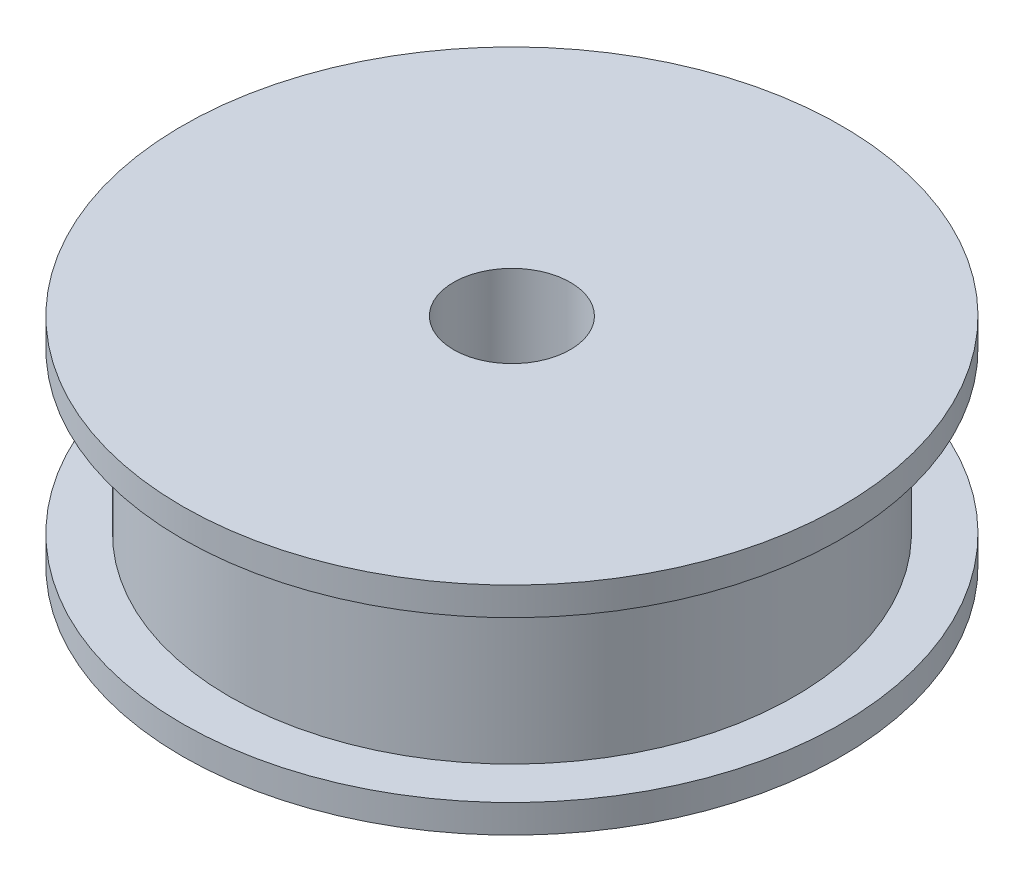
ISO-10303-21;
HEADER;
FILE_DESCRIPTION(('STEP AP214'),'2;1');
FILE_NAME('part.step','',(''),(''),'','','');
FILE_SCHEMA(('AUTOMOTIVE_DESIGN { 1 0 10303 214 1 1 1 1 }'));
ENDSEC;
DATA;
#1=APPLICATION_CONTEXT('core data for automotive mechanical design processes');
#2=APPLICATION_PROTOCOL_DEFINITION('international standard','automotive_design',2000,#1);
#3=PRODUCT_CONTEXT('',#1,'mechanical');
#4=PRODUCT('Part','Part','',(#3));
#5=PRODUCT_RELATED_PRODUCT_CATEGORY('part','',(#4));
#6=PRODUCT_DEFINITION_FORMATION('','',#4);
#7=PRODUCT_DEFINITION_CONTEXT('part definition',#1,'design');
#8=PRODUCT_DEFINITION('design','',#6,#7);
#9=PRODUCT_DEFINITION_SHAPE('','',#8);
#10=(LENGTH_UNIT() NAMED_UNIT(*) SI_UNIT(.MILLI.,.METRE.));
#11=(NAMED_UNIT(*) PLANE_ANGLE_UNIT() SI_UNIT($,.RADIAN.));
#12=(NAMED_UNIT(*) SI_UNIT($,.STERADIAN.) SOLID_ANGLE_UNIT());
#13=UNCERTAINTY_MEASURE_WITH_UNIT(LENGTH_MEASURE(1.E-05),#10,'distance_accuracy_value','');
#14=(GEOMETRIC_REPRESENTATION_CONTEXT(3) GLOBAL_UNCERTAINTY_ASSIGNED_CONTEXT((#13)) GLOBAL_UNIT_ASSIGNED_CONTEXT((#10,
#11,#12)) REPRESENTATION_CONTEXT('',''));
#15=CARTESIAN_POINT('',(0.,0.,0.));
#16=DIRECTION('',(0.,0.,1.));
#17=DIRECTION('',(1.,0.,0.));
#18=AXIS2_PLACEMENT_3D('',#15,#16,#17);
#19=CARTESIAN_POINT('',(0.,5.,0.));
#20=DIRECTION('',(0.,-1.,0.));
#21=DIRECTION('',(0.,0.,-1.));
#22=AXIS2_PLACEMENT_3D('',#19,#20,#21);
#23=CYLINDRICAL_SURFACE('',#22,15.);
#24=CARTESIAN_POINT('',(0.,-3.5,0.));
#25=DIRECTION('',(0.,1.,0.));
#26=DIRECTION('',(0.,0.,1.));
#27=AXIS2_PLACEMENT_3D('',#24,#25,#26);
#28=CIRCLE('',#27,15.);
#29=CARTESIAN_POINT('',(0.,-3.5,15.));
#30=VERTEX_POINT('',#29);
#31=EDGE_CURVE('E54',#30,#30,#28,.T.);
#32=ORIENTED_EDGE('',*,*,#31,.T.);
#33=EDGE_LOOP('',(#32));
#34=FACE_BOUND('',#33,.T.);
#35=CARTESIAN_POINT('',(0.,5.,0.));
#36=DIRECTION('',(0.,1.,0.));
#37=DIRECTION('',(0.,0.,1.));
#38=AXIS2_PLACEMENT_3D('',#35,#36,#37);
#39=CIRCLE('',#38,15.);
#40=CARTESIAN_POINT('',(0.,5.,15.));
#41=VERTEX_POINT('',#40);
#42=EDGE_CURVE('E10',#41,#41,#39,.T.);
#43=ORIENTED_EDGE('',*,*,#42,.F.);
#44=EDGE_LOOP('',(#43));
#45=FACE_BOUND('',#44,.T.);
#46=ADVANCED_FACE('F37',(#34,#45),#23,.T.);
#47=CARTESIAN_POINT('',(0.,6.5,0.));
#48=DIRECTION('',(0.,-1.,0.));
#49=DIRECTION('',(0.,0.,-1.));
#50=AXIS2_PLACEMENT_3D('',#47,#48,#49);
#51=CYLINDRICAL_SURFACE('',#50,17.5);
#52=CARTESIAN_POINT('',(0.,6.5,0.));
#53=DIRECTION('',(0.,1.,0.));
#54=DIRECTION('',(0.,0.,1.));
#55=AXIS2_PLACEMENT_3D('',#52,#53,#54);
#56=CIRCLE('',#55,17.5);
#57=CARTESIAN_POINT('',(0.,6.5,17.5));
#58=VERTEX_POINT('',#57);
#59=EDGE_CURVE('E45',#58,#58,#56,.T.);
#60=ORIENTED_EDGE('',*,*,#59,.F.);
#61=EDGE_LOOP('',(#60));
#62=FACE_BOUND('',#61,.T.);
#63=CARTESIAN_POINT('',(0.,5.,0.));
#64=DIRECTION('',(0.,1.,0.));
#65=DIRECTION('',(0.,0.,1.));
#66=AXIS2_PLACEMENT_3D('',#63,#64,#65);
#67=CIRCLE('',#66,17.5);
#68=CARTESIAN_POINT('',(0.,5.,17.5));
#69=VERTEX_POINT('',#68);
#70=EDGE_CURVE('E51',#69,#69,#67,.T.);
#71=ORIENTED_EDGE('',*,*,#70,.T.);
#72=EDGE_LOOP('',(#71));
#73=FACE_BOUND('',#72,.T.);
#74=ADVANCED_FACE('F93',(#62,#73),#51,.T.);
#75=CARTESIAN_POINT('',(0.,6.5,0.));
#76=DIRECTION('',(0.,1.,0.));
#77=DIRECTION('',(0.,0.,1.));
#78=AXIS2_PLACEMENT_3D('',#75,#76,#77);
#79=PLANE('',#78);
#80=CARTESIAN_POINT('',(0.,6.5,0.));
#81=DIRECTION('',(0.,1.,0.));
#82=DIRECTION('',(0.,0.,1.));
#83=AXIS2_PLACEMENT_3D('',#80,#81,#82);
#84=CIRCLE('',#83,3.1);
#85=CARTESIAN_POINT('',(0.,6.5,3.1));
#86=VERTEX_POINT('',#85);
#87=EDGE_CURVE('E72',#86,#86,#84,.T.);
#88=ORIENTED_EDGE('',*,*,#87,.F.);
#89=EDGE_LOOP('',(#88));
#90=FACE_BOUND('',#89,.T.);
#91=ORIENTED_EDGE('',*,*,#59,.T.);
#92=EDGE_LOOP('',(#91));
#93=FACE_BOUND('',#92,.T.);
#94=ADVANCED_FACE('F97',(#90,#93),#79,.T.);
#95=CARTESIAN_POINT('',(0.,5.,0.));
#96=DIRECTION('',(0.,1.,0.));
#97=DIRECTION('',(0.,0.,1.));
#98=AXIS2_PLACEMENT_3D('',#95,#96,#97);
#99=PLANE('',#98);
#100=ORIENTED_EDGE('',*,*,#42,.T.);
#101=EDGE_LOOP('',(#100));
#102=FACE_BOUND('',#101,.T.);
#103=ORIENTED_EDGE('',*,*,#70,.F.);
#104=EDGE_LOOP('',(#103));
#105=FACE_BOUND('',#104,.T.);
#106=ADVANCED_FACE('F104',(#102,#105),#99,.F.);
#107=CARTESIAN_POINT('',(0.,-3.5,0.));
#108=DIRECTION('',(0.,-1.,0.));
#109=DIRECTION('',(0.,0.,-1.));
#110=AXIS2_PLACEMENT_3D('',#107,#108,#109);
#111=CYLINDRICAL_SURFACE('',#110,17.5);
#112=CARTESIAN_POINT('',(0.,-3.5,0.));
#113=DIRECTION('',(0.,1.,0.));
#114=DIRECTION('',(0.,0.,1.));
#115=AXIS2_PLACEMENT_3D('',#112,#113,#114);
#116=CIRCLE('',#115,17.5);
#117=CARTESIAN_POINT('',(0.,-3.5,17.5));
#118=VERTEX_POINT('',#117);
#119=EDGE_CURVE('E57',#118,#118,#116,.T.);
#120=ORIENTED_EDGE('',*,*,#119,.F.);
#121=EDGE_LOOP('',(#120));
#122=FACE_BOUND('',#121,.T.);
#123=CARTESIAN_POINT('',(0.,-5.,0.));
#124=DIRECTION('',(0.,1.,0.));
#125=DIRECTION('',(0.,0.,1.));
#126=AXIS2_PLACEMENT_3D('',#123,#124,#125);
#127=CIRCLE('',#126,17.5);
#128=CARTESIAN_POINT('',(0.,-5.,17.5));
#129=VERTEX_POINT('',#128);
#130=EDGE_CURVE('E64',#129,#129,#127,.T.);
#131=ORIENTED_EDGE('',*,*,#130,.T.);
#132=EDGE_LOOP('',(#131));
#133=FACE_BOUND('',#132,.T.);
#134=ADVANCED_FACE('F111',(#122,#133),#111,.T.);
#135=CARTESIAN_POINT('',(0.,-3.5,0.));
#136=DIRECTION('',(0.,1.,0.));
#137=DIRECTION('',(0.,0.,1.));
#138=AXIS2_PLACEMENT_3D('',#135,#136,#137);
#139=PLANE('',#138);
#140=ORIENTED_EDGE('',*,*,#31,.F.);
#141=EDGE_LOOP('',(#140));
#142=FACE_BOUND('',#141,.T.);
#143=ORIENTED_EDGE('',*,*,#119,.T.);
#144=EDGE_LOOP('',(#143));
#145=FACE_BOUND('',#144,.T.);
#146=ADVANCED_FACE('F90',(#142,#145),#139,.T.);
#147=CARTESIAN_POINT('',(0.,-5.,0.));
#148=DIRECTION('',(0.,1.,0.));
#149=DIRECTION('',(0.,0.,1.));
#150=AXIS2_PLACEMENT_3D('',#147,#148,#149);
#151=PLANE('',#150);
#152=CARTESIAN_POINT('',(0.,-5.,0.));
#153=DIRECTION('',(0.,1.,0.));
#154=DIRECTION('',(0.,0.,1.));
#155=AXIS2_PLACEMENT_3D('',#152,#153,#154);
#156=CIRCLE('',#155,3.1);
#157=CARTESIAN_POINT('',(0.,-5.,3.1));
#158=VERTEX_POINT('',#157);
#159=EDGE_CURVE('E40',#158,#158,#156,.T.);
#160=ORIENTED_EDGE('',*,*,#159,.T.);
#161=EDGE_LOOP('',(#160));
#162=FACE_BOUND('',#161,.T.);
#163=ORIENTED_EDGE('',*,*,#130,.F.);
#164=EDGE_LOOP('',(#163));
#165=FACE_BOUND('',#164,.T.);
#166=ADVANCED_FACE('F81',(#162,#165),#151,.F.);
#167=CARTESIAN_POINT('',(0.,-6.5,0.));
#168=DIRECTION('',(0.,1.,0.));
#169=DIRECTION('',(0.,0.,1.));
#170=AXIS2_PLACEMENT_3D('',#167,#168,#169);
#171=CYLINDRICAL_SURFACE('',#170,3.1);
#172=CARTESIAN_POINT('',(0.,6.5,3.1));
#173=CARTESIAN_POINT('',(0.,6.38020833333333,3.1));
#174=CARTESIAN_POINT('',(0.,6.26041666666667,3.1));
#175=CARTESIAN_POINT('',(0.,6.02083333333333,3.1));
#176=CARTESIAN_POINT('',(0.,5.90104166666667,3.1));
#177=CARTESIAN_POINT('',(0.,5.66145833333333,3.1));
#178=CARTESIAN_POINT('',(0.,5.54166666666667,3.1));
#179=CARTESIAN_POINT('',(0.,5.30208333333333,3.1));
#180=CARTESIAN_POINT('',(0.,5.18229166666667,3.1));
#181=CARTESIAN_POINT('',(0.,4.94270833333333,3.1));
#182=CARTESIAN_POINT('',(0.,4.82291666666667,3.1));
#183=CARTESIAN_POINT('',(0.,4.58333333333333,3.1));
#184=CARTESIAN_POINT('',(0.,4.46354166666667,3.1));
#185=CARTESIAN_POINT('',(0.,4.22395833333333,3.1));
#186=CARTESIAN_POINT('',(0.,4.10416666666667,3.1));
#187=CARTESIAN_POINT('',(0.,3.86458333333333,3.1));
#188=CARTESIAN_POINT('',(0.,3.74479166666667,3.1));
#189=CARTESIAN_POINT('',(0.,3.50520833333333,3.1));
#190=CARTESIAN_POINT('',(0.,3.38541666666667,3.1));
#191=CARTESIAN_POINT('',(0.,3.14583333333333,3.1));
#192=CARTESIAN_POINT('',(0.,3.02604166666667,3.1));
#193=CARTESIAN_POINT('',(0.,2.78645833333333,3.1));
#194=CARTESIAN_POINT('',(0.,2.66666666666667,3.1));
#195=CARTESIAN_POINT('',(0.,2.42708333333333,3.1));
#196=CARTESIAN_POINT('',(0.,2.30729166666667,3.1));
#197=CARTESIAN_POINT('',(0.,2.06770833333333,3.1));
#198=CARTESIAN_POINT('',(0.,1.94791666666667,3.1));
#199=CARTESIAN_POINT('',(0.,1.70833333333333,3.1));
#200=CARTESIAN_POINT('',(0.,1.58854166666667,3.1));
#201=CARTESIAN_POINT('',(0.,1.34895833333333,3.1));
#202=CARTESIAN_POINT('',(0.,1.22916666666667,3.1));
#203=CARTESIAN_POINT('',(0.,0.989583333333333,3.1));
#204=CARTESIAN_POINT('',(0.,0.869791666666667,3.1));
#205=CARTESIAN_POINT('',(0.,0.630208333333333,3.1));
#206=CARTESIAN_POINT('',(0.,0.510416666666666,3.1));
#207=CARTESIAN_POINT('',(0.,0.270833333333333,3.1));
#208=CARTESIAN_POINT('',(0.,0.151041666666667,3.1));
#209=CARTESIAN_POINT('',(0.,-0.0885416666666668,3.1));
#210=CARTESIAN_POINT('',(0.,-0.208333333333334,3.1));
#211=CARTESIAN_POINT('',(0.,-0.447916666666667,3.1));
#212=CARTESIAN_POINT('',(0.,-0.567708333333334,3.1));
#213=CARTESIAN_POINT('',(0.,-0.807291666666667,3.1));
#214=CARTESIAN_POINT('',(0.,-0.927083333333334,3.1));
#215=CARTESIAN_POINT('',(0.,-1.16666666666667,3.1));
#216=CARTESIAN_POINT('',(0.,-1.28645833333333,3.1));
#217=CARTESIAN_POINT('',(0.,-1.52604166666667,3.1));
#218=CARTESIAN_POINT('',(0.,-1.64583333333333,3.1));
#219=CARTESIAN_POINT('',(0.,-1.88541666666667,3.1));
#220=CARTESIAN_POINT('',(0.,-2.00520833333333,3.1));
#221=CARTESIAN_POINT('',(0.,-2.24479166666667,3.1));
#222=CARTESIAN_POINT('',(0.,-2.36458333333333,3.1));
#223=CARTESIAN_POINT('',(0.,-2.60416666666667,3.1));
#224=CARTESIAN_POINT('',(0.,-2.72395833333333,3.1));
#225=CARTESIAN_POINT('',(0.,-2.96354166666667,3.1));
#226=CARTESIAN_POINT('',(0.,-3.08333333333333,3.1));
#227=CARTESIAN_POINT('',(0.,-3.32291666666667,3.1));
#228=CARTESIAN_POINT('',(0.,-3.44270833333333,3.1));
#229=CARTESIAN_POINT('',(0.,-3.68229166666667,3.1));
#230=CARTESIAN_POINT('',(0.,-3.80208333333333,3.1));
#231=CARTESIAN_POINT('',(0.,-4.04166666666667,3.1));
#232=CARTESIAN_POINT('',(0.,-4.16145833333333,3.1));
#233=CARTESIAN_POINT('',(0.,-4.40104166666667,3.1));
#234=CARTESIAN_POINT('',(0.,-4.52083333333333,3.1));
#235=CARTESIAN_POINT('',(0.,-4.76041666666667,3.1));
#236=CARTESIAN_POINT('',(0.,-4.88020833333333,3.1));
#237=CARTESIAN_POINT('',(0.,-5.,3.1));
#238=B_SPLINE_CURVE_WITH_KNOTS('',3,(#172,#173,#174,#175,#176,#177,#178,#179,#180,#181,#182,
#183,#184,#185,#186,#187,#188,#189,#190,#191,#192,#193,#194,#195,#196,#197,#198,#199,#200,#201,
#202,#203,#204,#205,#206,#207,#208,#209,#210,#211,#212,#213,#214,#215,#216,#217,#218,#219,#220,
#221,#222,#223,#224,#225,#226,#227,#228,#229,#230,#231,#232,#233,#234,#235,#236,#237),
.UNSPECIFIED.,.F.,.F.,(4,2,2,2,2,2,2,2,2,2,2,2,2,2,2,2,2,2,2,2,2,2,2,2,2,2,2,2,2,2,2,2,4),(0.,
0.359375,0.718750000000001,1.078125,1.4375,1.796875,2.15625,2.515625,2.875,3.234375,3.59375,
3.953125,4.3125,4.671875,5.03125,5.390625,5.75,6.109375,6.46875,6.828125,7.1875,7.546875,
7.90625,8.265625,8.625,8.984375,9.34375,9.703125,10.0625,10.421875,10.78125,11.140625,11.5),.UNSPECIFIED.);
#239=EDGE_CURVE('BSEAM84',#86,#158,#238,.T.);
#240=ORIENTED_EDGE('',*,*,#87,.T.);
#241=ORIENTED_EDGE('',*,*,#159,.F.);
#242=ORIENTED_EDGE('',*,*,#239,.T.);
#243=ORIENTED_EDGE('',*,*,#239,.F.);
#244=EDGE_LOOP('',(#240,#242,#241,#243));
#245=FACE_BOUND('',#244,.T.);
#246=ADVANCED_FACE('F84',(#245),#171,.F.);
#247=CLOSED_SHELL('',(#46,#74,#94,#106,#134,#146,#166,#246));
#248=MANIFOLD_SOLID_BREP('B2',#247);
#249=ADVANCED_BREP_SHAPE_REPRESENTATION('',(#18,#248),#14);
#250=SHAPE_DEFINITION_REPRESENTATION(#9,#249);
ENDSEC;
END-ISO-10303-21;
